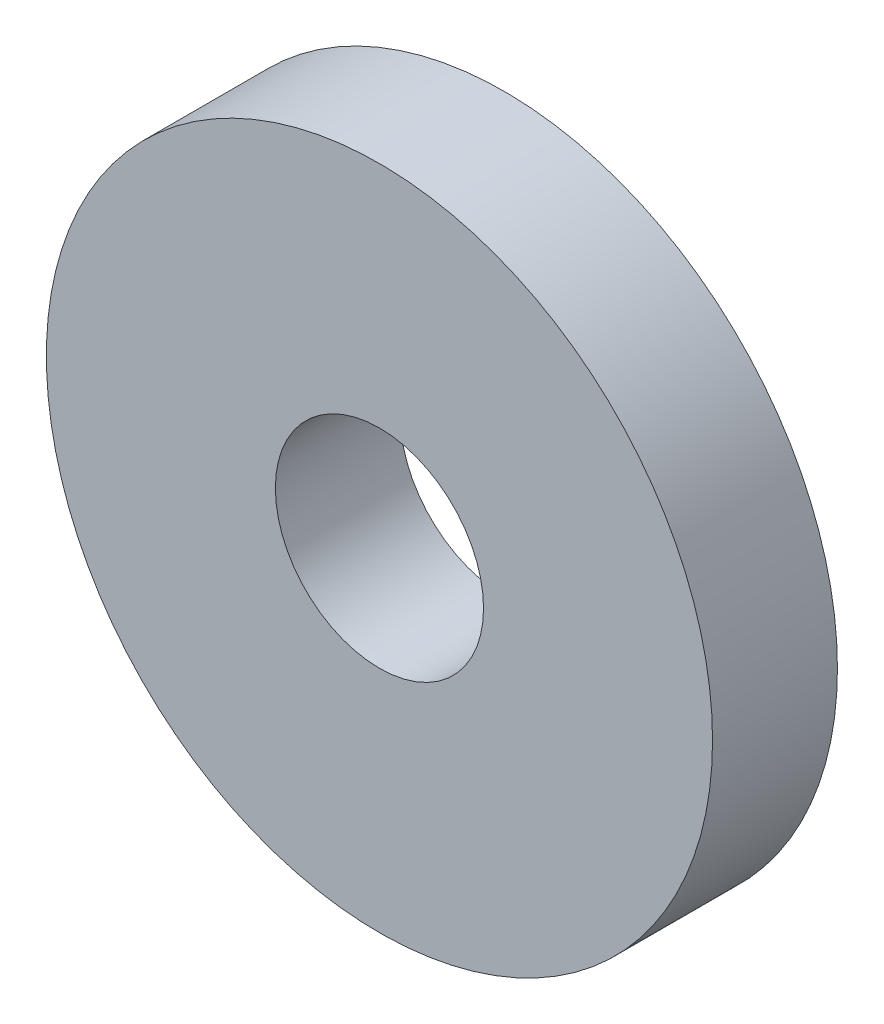
ISO-10303-21;
HEADER;
FILE_DESCRIPTION(('STEP AP214'),'2;1');
FILE_NAME('part.step','',(''),(''),'','','');
FILE_SCHEMA(('AUTOMOTIVE_DESIGN { 1 0 10303 214 1 1 1 1 }'));
ENDSEC;
DATA;
#1=APPLICATION_CONTEXT('core data for automotive mechanical design processes');
#2=APPLICATION_PROTOCOL_DEFINITION('international standard','automotive_design',2000,#1);
#3=PRODUCT_CONTEXT('',#1,'mechanical');
#4=PRODUCT('Part','Part','',(#3));
#5=PRODUCT_RELATED_PRODUCT_CATEGORY('part','',(#4));
#6=PRODUCT_DEFINITION_FORMATION('','',#4);
#7=PRODUCT_DEFINITION_CONTEXT('part definition',#1,'design');
#8=PRODUCT_DEFINITION('design','',#6,#7);
#9=PRODUCT_DEFINITION_SHAPE('','',#8);
#10=(LENGTH_UNIT() NAMED_UNIT(*) SI_UNIT(.MILLI.,.METRE.));
#11=(NAMED_UNIT(*) PLANE_ANGLE_UNIT() SI_UNIT($,.RADIAN.));
#12=(NAMED_UNIT(*) SI_UNIT($,.STERADIAN.) SOLID_ANGLE_UNIT());
#13=UNCERTAINTY_MEASURE_WITH_UNIT(LENGTH_MEASURE(1.E-05),#10,'distance_accuracy_value','');
#14=(GEOMETRIC_REPRESENTATION_CONTEXT(3) GLOBAL_UNCERTAINTY_ASSIGNED_CONTEXT((#13)) GLOBAL_UNIT_ASSIGNED_CONTEXT((#10,
#11,#12)) REPRESENTATION_CONTEXT('',''));
#15=CARTESIAN_POINT('',(0.,0.,0.));
#16=DIRECTION('',(0.,0.,1.));
#17=DIRECTION('',(1.,0.,0.));
#18=AXIS2_PLACEMENT_3D('',#15,#16,#17);
#19=CARTESIAN_POINT('',(0.,0.,3.));
#20=DIRECTION('',(0.,0.,-1.));
#21=DIRECTION('',(-1.,0.,0.));
#22=AXIS2_PLACEMENT_3D('',#19,#20,#21);
#23=CYLINDRICAL_SURFACE('',#22,8.);
#24=CARTESIAN_POINT('',(0.,0.,3.));
#25=DIRECTION('',(0.,0.,1.));
#26=DIRECTION('',(1.,0.,0.));
#27=AXIS2_PLACEMENT_3D('',#24,#25,#26);
#28=CIRCLE('',#27,8.);
#29=CARTESIAN_POINT('',(8.,0.,3.));
#30=VERTEX_POINT('',#29);
#31=EDGE_CURVE('E10',#30,#30,#28,.T.);
#32=ORIENTED_EDGE('',*,*,#31,.F.);
#33=EDGE_LOOP('',(#32));
#34=FACE_BOUND('',#33,.T.);
#35=CARTESIAN_POINT('',(0.,0.,0.));
#36=DIRECTION('',(0.,0.,1.));
#37=DIRECTION('',(1.,0.,0.));
#38=AXIS2_PLACEMENT_3D('',#35,#36,#37);
#39=CIRCLE('',#38,8.);
#40=CARTESIAN_POINT('',(8.,0.,0.));
#41=VERTEX_POINT('',#40);
#42=EDGE_CURVE('E34',#41,#41,#39,.T.);
#43=ORIENTED_EDGE('',*,*,#42,.T.);
#44=EDGE_LOOP('',(#43));
#45=FACE_BOUND('',#44,.T.);
#46=ADVANCED_FACE('F31',(#34,#45),#23,.T.);
#47=CARTESIAN_POINT('',(0.,0.,3.));
#48=DIRECTION('',(0.,0.,1.));
#49=DIRECTION('',(1.,0.,0.));
#50=AXIS2_PLACEMENT_3D('',#47,#48,#49);
#51=PLANE('',#50);
#52=CARTESIAN_POINT('',(0.,0.,3.));
#53=DIRECTION('',(0.,0.,1.));
#54=DIRECTION('',(1.,0.,0.));
#55=AXIS2_PLACEMENT_3D('',#52,#53,#54);
#56=CIRCLE('',#55,2.5);
#57=CARTESIAN_POINT('',(2.5,0.,3.));
#58=VERTEX_POINT('',#57);
#59=EDGE_CURVE('E43',#58,#58,#56,.T.);
#60=ORIENTED_EDGE('',*,*,#59,.F.);
#61=EDGE_LOOP('',(#60));
#62=FACE_BOUND('',#61,.T.);
#63=ORIENTED_EDGE('',*,*,#31,.T.);
#64=EDGE_LOOP('',(#63));
#65=FACE_BOUND('',#64,.T.);
#66=ADVANCED_FACE('F58',(#62,#65),#51,.T.);
#67=CARTESIAN_POINT('',(0.,0.,0.));
#68=DIRECTION('',(0.,0.,1.));
#69=DIRECTION('',(1.,0.,0.));
#70=AXIS2_PLACEMENT_3D('',#67,#68,#69);
#71=PLANE('',#70);
#72=CARTESIAN_POINT('',(0.,0.,0.));
#73=DIRECTION('',(0.,0.,1.));
#74=DIRECTION('',(1.,0.,0.));
#75=AXIS2_PLACEMENT_3D('',#72,#73,#74);
#76=CIRCLE('',#75,2.5);
#77=CARTESIAN_POINT('',(2.5,0.,0.));
#78=VERTEX_POINT('',#77);
#79=EDGE_CURVE('E41',#78,#78,#76,.T.);
#80=ORIENTED_EDGE('',*,*,#79,.T.);
#81=EDGE_LOOP('',(#80));
#82=FACE_BOUND('',#81,.T.);
#83=ORIENTED_EDGE('',*,*,#42,.F.);
#84=EDGE_LOOP('',(#83));
#85=FACE_BOUND('',#84,.T.);
#86=ADVANCED_FACE('F49',(#82,#85),#71,.F.);
#87=CARTESIAN_POINT('',(0.,0.,0.));
#88=DIRECTION('',(0.,0.,1.));
#89=DIRECTION('',(1.,0.,0.));
#90=AXIS2_PLACEMENT_3D('',#87,#88,#89);
#91=CYLINDRICAL_SURFACE('',#90,2.5);
#92=ORIENTED_EDGE('',*,*,#79,.F.);
#93=EDGE_LOOP('',(#92));
#94=FACE_BOUND('',#93,.T.);
#95=ORIENTED_EDGE('',*,*,#59,.T.);
#96=EDGE_LOOP('',(#95));
#97=FACE_BOUND('',#96,.T.);
#98=ADVANCED_FACE('F52',(#94,#97),#91,.F.);
#99=CLOSED_SHELL('',(#46,#66,#86,#98));
#100=MANIFOLD_SOLID_BREP('B2',#99);
#101=ADVANCED_BREP_SHAPE_REPRESENTATION('',(#18,#100),#14);
#102=SHAPE_DEFINITION_REPRESENTATION(#9,#101);
ENDSEC;
END-ISO-10303-21;
